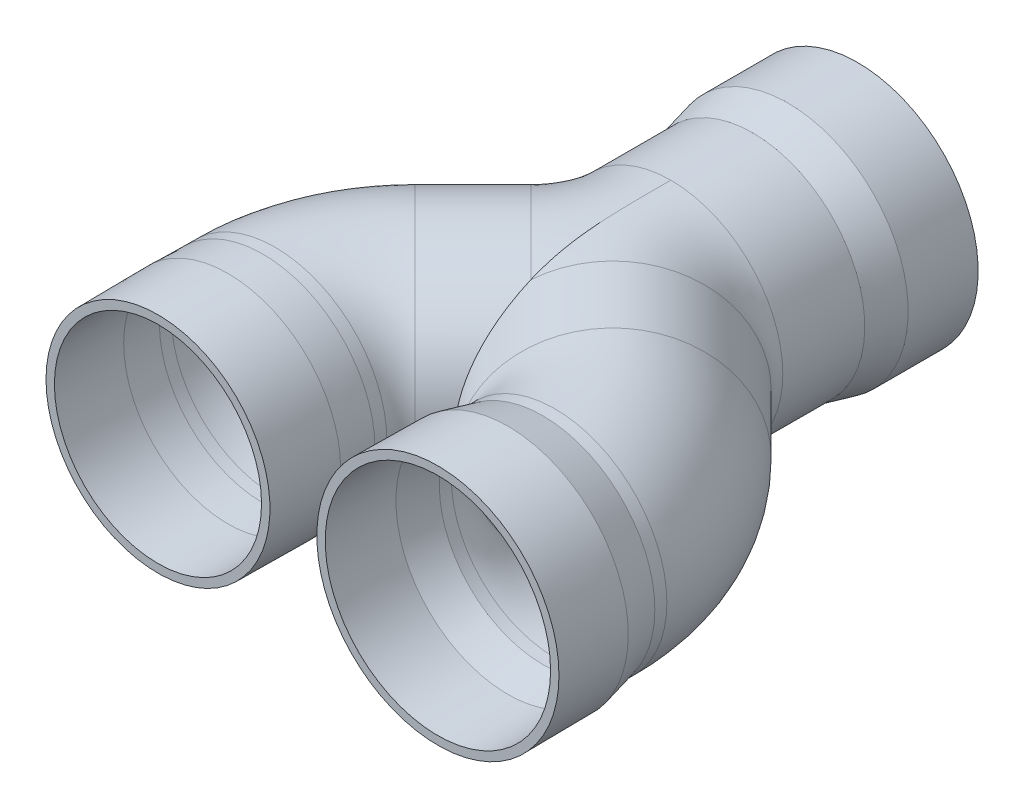
ISO-10303-21;
HEADER;
FILE_DESCRIPTION(('STEP AP214'),'2;1');
FILE_NAME('part.step','',(''),(''),'','','');
FILE_SCHEMA(('AUTOMOTIVE_DESIGN { 1 0 10303 214 1 1 1 1 }'));
ENDSEC;
DATA;
#1=APPLICATION_CONTEXT('core data for automotive mechanical design processes');
#2=APPLICATION_PROTOCOL_DEFINITION('international standard','automotive_design',2000,#1);
#3=PRODUCT_CONTEXT('',#1,'mechanical');
#4=PRODUCT('Part','Part','',(#3));
#5=PRODUCT_RELATED_PRODUCT_CATEGORY('part','',(#4));
#6=PRODUCT_DEFINITION_FORMATION('','',#4);
#7=PRODUCT_DEFINITION_CONTEXT('part definition',#1,'design');
#8=PRODUCT_DEFINITION('design','',#6,#7);
#9=PRODUCT_DEFINITION_SHAPE('','',#8);
#10=(LENGTH_UNIT() NAMED_UNIT(*) SI_UNIT(.MILLI.,.METRE.));
#11=(NAMED_UNIT(*) PLANE_ANGLE_UNIT() SI_UNIT($,.RADIAN.));
#12=(NAMED_UNIT(*) SI_UNIT($,.STERADIAN.) SOLID_ANGLE_UNIT());
#13=UNCERTAINTY_MEASURE_WITH_UNIT(LENGTH_MEASURE(1.E-05),#10,'distance_accuracy_value','');
#14=(GEOMETRIC_REPRESENTATION_CONTEXT(3) GLOBAL_UNCERTAINTY_ASSIGNED_CONTEXT((#13)) GLOBAL_UNIT_ASSIGNED_CONTEXT((#10,
#11,#12)) REPRESENTATION_CONTEXT('',''));
#15=CARTESIAN_POINT('',(0.,0.,0.));
#16=DIRECTION('',(0.,0.,1.));
#17=DIRECTION('',(1.,0.,0.));
#18=AXIS2_PLACEMENT_3D('',#15,#16,#17);
#19=CARTESIAN_POINT('',(20.,0.,40.0000000000023));
#20=DIRECTION('',(0.,0.,1.));
#21=DIRECTION('',(-1.,0.,0.));
#22=AXIS2_PLACEMENT_3D('',#19,#20,#21);
#23=PLANE('',#22);
#24=CARTESIAN_POINT('',(20.,0.,40.0000000000023));
#25=DIRECTION('',(0.,0.,1.));
#26=DIRECTION('',(1.,0.,0.));
#27=AXIS2_PLACEMENT_3D('',#24,#25,#26);
#28=CIRCLE('',#27,14.8);
#29=CARTESIAN_POINT('',(34.8,0.,40.0000000000023));
#30=VERTEX_POINT('',#29);
#31=EDGE_CURVE('E102',#30,#30,#28,.T.);
#32=ORIENTED_EDGE('',*,*,#31,.F.);
#33=EDGE_LOOP('',(#32));
#34=FACE_BOUND('',#33,.T.);
#35=CARTESIAN_POINT('',(20.,0.,40.0000000000023));
#36=DIRECTION('',(0.,0.,1.));
#37=DIRECTION('',(1.,0.,0.));
#38=AXIS2_PLACEMENT_3D('',#35,#36,#37);
#39=CIRCLE('',#38,14.8001200030001);
#40=CARTESIAN_POINT('',(34.8001200030001,0.,40.0000000000023));
#41=VERTEX_POINT('',#40);
#42=EDGE_CURVE('E88',#41,#41,#39,.T.);
#43=ORIENTED_EDGE('',*,*,#42,.T.);
#44=EDGE_LOOP('',(#43));
#45=FACE_BOUND('',#44,.T.);
#46=ADVANCED_FACE('F34',(#34,#45),#23,.T.);
#47=CARTESIAN_POINT('',(0.,0.,-10.));
#48=DIRECTION('',(0.,0.,1.));
#49=DIRECTION('',(1.,0.,0.));
#50=AXIS2_PLACEMENT_3D('',#47,#48,#49);
#51=CYLINDRICAL_SURFACE('',#50,16.);
#52=CARTESIAN_POINT('',(0.,0.,1.71572875253808));
#53=DIRECTION('',(0.,0.,1.));
#54=DIRECTION('',(1.,0.,0.));
#55=AXIS2_PLACEMENT_3D('',#52,#53,#54);
#56=CIRCLE('',#55,16.);
#57=CARTESIAN_POINT('',(0.,16.,1.71572875253808));
#58=VERTEX_POINT('',#57);
#59=CARTESIAN_POINT('',(0.,-16.,1.71572875253808));
#60=VERTEX_POINT('',#59);
#61=EDGE_CURVE('E202',#58,#60,#56,.T.);
#62=ORIENTED_EDGE('',*,*,#61,.F.);
#63=CARTESIAN_POINT('',(0.,0.,1.71572875253808));
#64=DIRECTION('',(0.,0.,-1.));
#65=DIRECTION('',(-1.,0.,0.));
#66=AXIS2_PLACEMENT_3D('',#63,#64,#65);
#67=CIRCLE('',#66,16.);
#68=EDGE_CURVE('E48',#60,#58,#67,.F.);
#69=ORIENTED_EDGE('',*,*,#68,.F.);
#70=EDGE_LOOP('',(#62,#69));
#71=FACE_BOUND('',#70,.T.);
#72=CARTESIAN_POINT('',(0.,0.,-10.));
#73=DIRECTION('',(0.,0.,-1.));
#74=DIRECTION('',(-1.,0.,0.));
#75=AXIS2_PLACEMENT_3D('',#72,#73,#74);
#76=CIRCLE('',#75,16.);
#77=CARTESIAN_POINT('',(-16.,0.,-10.));
#78=VERTEX_POINT('',#77);
#79=EDGE_CURVE('E205',#78,#78,#76,.T.);
#80=ORIENTED_EDGE('',*,*,#79,.F.);
#81=EDGE_LOOP('',(#80));
#82=FACE_BOUND('',#81,.T.);
#83=ADVANCED_FACE('F193',(#71,#82),#51,.T.);
#84=CARTESIAN_POINT('',(-20.,0.,1.71572875253809));
#85=DIRECTION('',(0.,-1.,0.));
#86=DIRECTION('',(0.,0.,-1.));
#87=AXIS2_PLACEMENT_3D('',#84,#85,#86);
#88=TOROIDAL_SURFACE('',#87,20.,16.);
#89=CARTESIAN_POINT('',(0.,-16.,1.71572875253809));
#90=CARTESIAN_POINT('',(0.,-15.9999995885486,1.78239541911259));
#91=CARTESIAN_POINT('',(0.,-15.999999719359,1.84906208579586));
#92=CARTESIAN_POINT('',(0.,-16.0000012587947,2.26057820688588));
#93=CARTESIAN_POINT('',(0.,-16.000005721768,2.60542766281114));
#94=CARTESIAN_POINT('',(0.,-15.9999037118699,3.2951266426043));
#95=CARTESIAN_POINT('',(0.,-15.9997972389732,3.63997616647219));
#96=CARTESIAN_POINT('',(0.,-15.9991737972668,4.3296819948509));
#97=CARTESIAN_POINT('',(0.,-15.9986568201817,4.67453829935826));
#98=CARTESIAN_POINT('',(0.,-15.996752152358,5.36424898287449));
#99=CARTESIAN_POINT('',(0.,-15.9953644610352,5.70910336188191));
#100=CARTESIAN_POINT('',(0.,-15.9911108252302,6.39915390088599));
#101=CARTESIAN_POINT('',(0.,-15.9882433853057,6.74435005337399));
#102=CARTESIAN_POINT('',(0.,-15.9802912799317,7.43471620589881));
#103=CARTESIAN_POINT('',(0.,-15.9752066117847,7.7798862059033));
#104=CARTESIAN_POINT('',(0.,-15.9553908978026,8.81530822843345));
#105=CARTESIAN_POINT('',(0.,-15.9360981126954,9.50549191150325));
#106=CARTESIAN_POINT('',(0.,-15.8778805648637,10.8818664699217));
#107=CARTESIAN_POINT('',(0.,-15.8390481349272,11.5680609108729));
#108=CARTESIAN_POINT('',(0.,-15.7335817334583,12.9385122892618));
#109=CARTESIAN_POINT('',(0.,-15.6669444375954,13.6227689851722));
#110=CARTESIAN_POINT('',(0.,-15.4977470971346,14.9852980113396));
#111=CARTESIAN_POINT('',(0.,-15.3952734483504,15.66358074764));
#112=CARTESIAN_POINT('',(0.,-15.1464206410807,17.0119371498042));
#113=CARTESIAN_POINT('',(0.,-15.0000635790645,17.6820147708365));
#114=CARTESIAN_POINT('',(0.,-14.7078361883334,18.8096463382895));
#115=CARTESIAN_POINT('',(0.,-14.575021141721,19.2705870631802));
#116=CARTESIAN_POINT('',(0.,-14.2821034083281,20.1839050741359));
#117=CARTESIAN_POINT('',(0.,-14.1219944453823,20.6362803639588));
#118=CARTESIAN_POINT('',(0.,-13.7728260744771,21.529158410911));
#119=CARTESIAN_POINT('',(0.,-13.5838010880145,21.9696745613851));
#120=CARTESIAN_POINT('',(0.,-13.1752011743323,22.8362841545151));
#121=CARTESIAN_POINT('',(0.,-12.9556310529747,23.2623798529468));
#122=CARTESIAN_POINT('',(0.,-12.4838713072097,24.0986126157083));
#123=CARTESIAN_POINT('',(0.,-12.2315454733101,24.5086731759023));
#124=CARTESIAN_POINT('',(0.,-11.6946121478873,25.3069918875532));
#125=CARTESIAN_POINT('',(0.,-11.4100124732465,25.6952552844737));
#126=CARTESIAN_POINT('',(0.,-10.8058736294958,26.4494663755816));
#127=CARTESIAN_POINT('',(0.,-10.4860459257667,26.8151845919195));
#128=CARTESIAN_POINT('',(0.,-9.98230787094179,27.3409883488809));
#129=CARTESIAN_POINT('',(0.,-9.81027271589528,27.5125677465881));
#130=CARTESIAN_POINT('',(0.,-9.45838753273782,27.8475676227136));
#131=CARTESIAN_POINT('',(0.,-9.27853634030152,28.0109868777006));
#132=CARTESIAN_POINT('',(0.,-9.09486800643466,28.1700658381668));
#133=B_SPLINE_CURVE_WITH_KNOTS('',3,(#89,#90,#91,#92,#93,#94,#95,#96,#97,#98,#99,#100,#101,#102,
#103,#104,#105,#106,#107,#108,#109,#110,#111,#112,#113,#114,#115,#116,#117,#118,#119,#120,#121,
#122,#123,#124,#125,#126,#127,#128,#129,#130,#131,#132),.UNSPECIFIED.,.F.,.F.,(4,2,2,2,2,2,2,2,
2,2,2,2,2,2,2,2,2,2,2,2,2,4),(0.,0.200000000000003,1.23454836187082,2.26909695947258,
3.30366641330175,4.33823656139013,5.37385430547361,6.40947330950129,8.48065240893641,
10.5421349848976,12.6038641009338,14.6606565932836,16.7164151699843,18.1547599548017,
19.59343593052,21.0304124518326,22.4671631395818,23.9100921115144,25.3526723424225,
26.8080971516561,27.5367845100533,28.2655807928366),.UNSPECIFIED.);
#134=CARTESIAN_POINT('',(0.,-13.6883472303443,21.7157287525382));
#135=VERTEX_POINT('',#134);
#136=EDGE_CURVE('E161',#135,#60,#133,.F.);
#137=ORIENTED_EDGE('',*,*,#136,.F.);
#138=CARTESIAN_POINT('',(-5.85786437626908,0.,15.8578643762691));
#139=DIRECTION('',(-0.707106781186549,0.,0.707106781186546));
#140=DIRECTION('',(0.707106781186546,0.,0.707106781186549));
#141=AXIS2_PLACEMENT_3D('',#138,#139,#140);
#142=CIRCLE('',#141,16.);
#143=CARTESIAN_POINT('',(0.,13.6883472303443,21.7157287525382));
#144=VERTEX_POINT('',#143);
#145=EDGE_CURVE('E292',#144,#135,#142,.T.);
#146=ORIENTED_EDGE('',*,*,#145,.F.);
#147=CARTESIAN_POINT('',(0.,16.,1.71572875253809));
#148=CARTESIAN_POINT('',(0.,15.999999585109,1.7823954185869));
#149=CARTESIAN_POINT('',(0.,15.9999997164776,1.84906208535536));
#150=CARTESIAN_POINT('',(0.,16.000001273304,2.26047363364034));
#151=CARTESIAN_POINT('',(0.,16.0000058109927,2.60521852582061));
#152=CARTESIAN_POINT('',(0.,15.9999037145828,3.29470832561645));
#153=CARTESIAN_POINT('',(0.,15.9997970804592,3.63945323323201));
#154=CARTESIAN_POINT('',(0.,15.9991750898949,4.32894995058784));
#155=CARTESIAN_POINT('',(0.,15.998659725291,4.67370176032845));
#156=CARTESIAN_POINT('',(0.,15.9967544433048,5.36320276173358));
#157=CARTESIAN_POINT('',(0.,15.9953645253293,5.70795195339617));
#158=CARTESIAN_POINT('',(0.,15.9890060872634,6.74288008923015));
#159=CARTESIAN_POINT('',(0.,15.9818472950911,7.43305183328253));
#160=CARTESIAN_POINT('',(0.,15.9554284181753,8.81318951708522));
#161=CARTESIAN_POINT('',(0.,15.9361685980154,9.50315546100527));
#162=CARTESIAN_POINT('',(0.,15.8780082569895,10.8795117182968));
#163=CARTESIAN_POINT('',(0.,15.8391882781953,11.565905125708));
#164=CARTESIAN_POINT('',(0.,15.7337429083843,12.9367515905961));
#165=CARTESIAN_POINT('',(0.,15.6671142495027,13.6212044105096));
#166=CARTESIAN_POINT('',(0.,15.497912554545,14.9841618024999));
#167=CARTESIAN_POINT('',(0.,15.3954242856575,15.6626765677884));
#168=CARTESIAN_POINT('',(0.,15.1465213003002,17.0114784722503));
#169=CARTESIAN_POINT('',(0.,15.0001283869091,17.6817695237444));
#170=CARTESIAN_POINT('',(0.,14.6884444818829,18.8844701047335));
#171=CARTESIAN_POINT('',(0.,14.5318695745793,19.4191273575059));
#172=CARTESIAN_POINT('',(0.,14.1814409259142,20.476439192315));
#173=CARTESIAN_POINT('',(0.,13.9875727257976,20.9990890307641));
#174=CARTESIAN_POINT('',(0.,13.5602764673973,22.0266441903181));
#175=CARTESIAN_POINT('',(0.,13.3269396746201,22.5315872752327));
#176=CARTESIAN_POINT('',(0.,12.8184087571785,23.5198225258644));
#177=CARTESIAN_POINT('',(0.,12.5432375576937,24.0031263632109));
#178=CARTESIAN_POINT('',(0.,12.094385574252,24.7138741591742));
#179=CARTESIAN_POINT('',(0.,11.93647486034,24.9513825609238));
#180=CARTESIAN_POINT('',(0.,11.6092924174464,25.4184548218814));
#181=CARTESIAN_POINT('',(0.,11.4400212698403,25.6480190867245));
#182=CARTESIAN_POINT('',(0.,11.0896620299194,26.098982514541));
#183=CARTESIAN_POINT('',(0.,10.9085422802307,26.3203571049578));
#184=CARTESIAN_POINT('',(0.,10.5350068761272,26.7534443816095));
#185=CARTESIAN_POINT('',(0.,10.3425886575052,26.9651548550275));
#186=CARTESIAN_POINT('',(0.,10.144610613478,27.1715728752538));
#187=B_SPLINE_CURVE_WITH_KNOTS('',3,(#147,#148,#149,#150,#151,#152,#153,#154,#155,#156,#157,
#158,#159,#160,#161,#162,#163,#164,#165,#166,#167,#168,#169,#170,#171,#172,#173,#174,#175,#176,
#177,#178,#179,#180,#181,#182,#183,#184,#185,#186),.UNSPECIFIED.,.F.,.F.,(4,2,2,2,2,2,2,2,2,2,2,
2,2,2,2,2,2,2,2,4),(0.,0.200000000000003,1.23423463530084,2.26846950380711,3.30272502878649,
4.33698125518974,6.40755696514552,8.47808740446149,10.5401609383907,12.6024768597937,
14.6599503234666,16.7164037314003,18.3865461757567,20.0573374506832,21.7243167922145,
23.3903859030564,24.2457418704929,25.1010540980133,25.9587530967588,26.8166475098539),.UNSPECIFIED.);
#188=EDGE_CURVE('E55',#58,#144,#187,.T.);
#189=ORIENTED_EDGE('',*,*,#188,.F.);
#190=ORIENTED_EDGE('',*,*,#61,.T.);
#191=EDGE_LOOP('',(#137,#146,#189,#190));
#192=FACE_BOUND('',#191,.T.);
#193=ADVANCED_FACE('F167',(#192),#88,.T.);
#194=CARTESIAN_POINT('',(-5.85786437626908,0.,15.8578643762691));
#195=DIRECTION('',(-0.707106781186547,0.,0.707106781186548));
#196=DIRECTION('',(0.707106781186548,0.,0.707106781186547));
#197=AXIS2_PLACEMENT_3D('',#194,#195,#196);
#198=CYLINDRICAL_SURFACE('',#197,16.);
#199=CARTESIAN_POINT('',(0.,0.,9.99999999999998));
#200=DIRECTION('',(-1.,0.,0.));
#201=DIRECTION('',(0.,0.,1.));
#202=AXIS2_PLACEMENT_3D('',#199,#200,#201);
#203=ELLIPSE('',#202,22.6274169979695,16.);
#204=EDGE_CURVE('E11',#144,#135,#203,.F.);
#205=ORIENTED_EDGE('',*,*,#204,.F.);
#206=ORIENTED_EDGE('',*,*,#145,.T.);
#207=EDGE_LOOP('',(#205,#206));
#208=FACE_BOUND('',#207,.T.);
#209=CARTESIAN_POINT('',(-14.1421356237309,0.,24.1421356237309));
#210=DIRECTION('',(-0.707106781186547,0.,0.707106781186548));
#211=DIRECTION('',(0.707106781186548,0.,0.707106781186547));
#212=AXIS2_PLACEMENT_3D('',#209,#210,#211);
#213=CIRCLE('',#212,16.);
#214=CARTESIAN_POINT('',(-25.4558441227157,0.,12.8284271247461));
#215=VERTEX_POINT('',#214);
#216=EDGE_CURVE('E293',#215,#215,#213,.T.);
#217=ORIENTED_EDGE('',*,*,#216,.F.);
#218=EDGE_LOOP('',(#217));
#219=FACE_BOUND('',#218,.T.);
#220=ADVANCED_FACE('F200',(#208,#219),#198,.T.);
#221=CARTESIAN_POINT('',(0.,0.,38.2842712474619));
#222=DIRECTION('',(0.,1.,0.));
#223=DIRECTION('',(0.,0.,1.));
#224=AXIS2_PLACEMENT_3D('',#221,#222,#223);
#225=TOROIDAL_SURFACE('',#224,20.,16.);
#226=CARTESIAN_POINT('',(-20.,0.,38.2842712474618));
#227=DIRECTION('',(0.,0.,1.));
#228=DIRECTION('',(1.,0.,0.));
#229=AXIS2_PLACEMENT_3D('',#226,#227,#228);
#230=CIRCLE('',#229,16.);
#231=CARTESIAN_POINT('',(-36.,0.,38.2842712474618));
#232=VERTEX_POINT('',#231);
#233=EDGE_CURVE('E298',#232,#232,#230,.T.);
#234=CARTESIAN_POINT('',(0.,0.,38.2842712474619));
#235=DIRECTION('',(0.,1.,0.));
#236=DIRECTION('',(0.,0.,1.));
#237=AXIS2_PLACEMENT_3D('',#234,#235,#236);
#238=CIRCLE('',#237,36.);
#239=EDGE_CURVE('',#215,#232,#238,.T.);
#240=ORIENTED_EDGE('',*,*,#216,.T.);
#241=ORIENTED_EDGE('',*,*,#233,.F.);
#242=ORIENTED_EDGE('',*,*,#239,.T.);
#243=ORIENTED_EDGE('',*,*,#239,.F.);
#244=EDGE_LOOP('',(#240,#242,#241,#243));
#245=FACE_BOUND('',#244,.T.);
#246=ADVANCED_FACE('F307',(#245),#225,.T.);
#247=CARTESIAN_POINT('',(-20.,0.,38.2842712474619));
#248=DIRECTION('',(0.,0.,1.));
#249=DIRECTION('',(1.,0.,0.));
#250=AXIS2_PLACEMENT_3D('',#247,#248,#249);
#251=CYLINDRICAL_SURFACE('',#250,16.);
#252=CARTESIAN_POINT('',(-20.,0.,40.0000000000023));
#253=DIRECTION('',(0.,0.,1.));
#254=DIRECTION('',(1.,0.,0.));
#255=AXIS2_PLACEMENT_3D('',#252,#253,#254);
#256=CIRCLE('',#255,16.);
#257=CARTESIAN_POINT('',(-3.99999999999999,0.,40.0000000000023));
#258=VERTEX_POINT('',#257);
#259=EDGE_CURVE('E38',#258,#258,#256,.T.);
#260=ORIENTED_EDGE('',*,*,#259,.F.);
#261=EDGE_LOOP('',(#260));
#262=FACE_BOUND('',#261,.T.);
#263=ORIENTED_EDGE('',*,*,#233,.T.);
#264=EDGE_LOOP('',(#263));
#265=FACE_BOUND('',#264,.T.);
#266=ADVANCED_FACE('F36',(#262,#265),#251,.T.);
#267=CARTESIAN_POINT('',(20.,0.,1.71572875253809));
#268=DIRECTION('',(0.,1.,0.));
#269=DIRECTION('',(0.,0.,1.));
#270=AXIS2_PLACEMENT_3D('',#267,#268,#269);
#271=TOROIDAL_SURFACE('',#270,20.,16.);
#272=CARTESIAN_POINT('',(5.85786437626908,0.,15.8578643762691));
#273=DIRECTION('',(-0.707106781186549,0.,-0.707106781186546));
#274=DIRECTION('',(-0.707106781186546,0.,0.707106781186549));
#275=AXIS2_PLACEMENT_3D('',#272,#273,#274);
#276=CIRCLE('',#275,16.);
#277=EDGE_CURVE('E142',#135,#144,#276,.F.);
#278=ORIENTED_EDGE('',*,*,#277,.F.);
#279=ORIENTED_EDGE('',*,*,#136,.T.);
#280=ORIENTED_EDGE('',*,*,#68,.T.);
#281=ORIENTED_EDGE('',*,*,#188,.T.);
#282=EDGE_LOOP('',(#278,#279,#280,#281));
#283=FACE_BOUND('',#282,.T.);
#284=ADVANCED_FACE('F171',(#283),#271,.T.);
#285=CARTESIAN_POINT('',(5.85786437626908,0.,15.8578643762691));
#286=DIRECTION('',(0.707106781186547,0.,0.707106781186548));
#287=DIRECTION('',(0.707106781186548,0.,-0.707106781186547));
#288=AXIS2_PLACEMENT_3D('',#285,#286,#287);
#289=CYLINDRICAL_SURFACE('',#288,16.);
#290=CARTESIAN_POINT('',(14.1421356237309,0.,24.1421356237309));
#291=DIRECTION('',(-0.707106781186547,0.,-0.707106781186548));
#292=DIRECTION('',(-0.707106781186548,0.,0.707106781186547));
#293=AXIS2_PLACEMENT_3D('',#290,#291,#292);
#294=CIRCLE('',#293,16.);
#295=CARTESIAN_POINT('',(25.4558441227157,0.,12.8284271247461));
#296=VERTEX_POINT('',#295);
#297=EDGE_CURVE('E145',#296,#296,#294,.F.);
#298=ORIENTED_EDGE('',*,*,#297,.F.);
#299=EDGE_LOOP('',(#298));
#300=FACE_BOUND('',#299,.T.);
#301=ORIENTED_EDGE('',*,*,#277,.T.);
#302=ORIENTED_EDGE('',*,*,#204,.T.);
#303=EDGE_LOOP('',(#301,#302));
#304=FACE_BOUND('',#303,.T.);
#305=ADVANCED_FACE('F176',(#300,#304),#289,.T.);
#306=CARTESIAN_POINT('',(0.,0.,38.2842712474619));
#307=DIRECTION('',(0.,-1.,0.));
#308=DIRECTION('',(0.,0.,-1.));
#309=AXIS2_PLACEMENT_3D('',#306,#307,#308);
#310=TOROIDAL_SURFACE('',#309,20.,16.);
#311=CARTESIAN_POINT('',(20.,0.,38.2842712474618));
#312=DIRECTION('',(0.,0.,-1.));
#313=DIRECTION('',(-1.,0.,0.));
#314=AXIS2_PLACEMENT_3D('',#311,#312,#313);
#315=CIRCLE('',#314,16.);
#316=CARTESIAN_POINT('',(36.,0.,38.2842712474618));
#317=VERTEX_POINT('',#316);
#318=EDGE_CURVE('E148',#317,#317,#315,.F.);
#319=CARTESIAN_POINT('',(0.,0.,38.2842712474619));
#320=DIRECTION('',(0.,-1.,0.));
#321=DIRECTION('',(0.,0.,-1.));
#322=AXIS2_PLACEMENT_3D('',#319,#320,#321);
#323=CIRCLE('',#322,36.);
#324=EDGE_CURVE('',#296,#317,#323,.T.);
#325=ORIENTED_EDGE('',*,*,#297,.T.);
#326=ORIENTED_EDGE('',*,*,#318,.F.);
#327=ORIENTED_EDGE('',*,*,#324,.T.);
#328=ORIENTED_EDGE('',*,*,#324,.F.);
#329=EDGE_LOOP('',(#325,#327,#326,#328));
#330=FACE_BOUND('',#329,.T.);
#331=ADVANCED_FACE('F184',(#330),#310,.T.);
#332=CARTESIAN_POINT('',(20.,0.,38.2842712474619));
#333=DIRECTION('',(0.,0.,1.));
#334=DIRECTION('',(1.,0.,0.));
#335=AXIS2_PLACEMENT_3D('',#332,#333,#334);
#336=CYLINDRICAL_SURFACE('',#335,16.);
#337=CARTESIAN_POINT('',(20.,0.,40.0000000000023));
#338=DIRECTION('',(0.,0.,-1.));
#339=DIRECTION('',(-1.,0.,0.));
#340=AXIS2_PLACEMENT_3D('',#337,#338,#339);
#341=CIRCLE('',#340,16.);
#342=CARTESIAN_POINT('',(3.99999999999999,0.,40.0000000000023));
#343=VERTEX_POINT('',#342);
#344=EDGE_CURVE('E151',#343,#343,#341,.F.);
#345=ORIENTED_EDGE('',*,*,#344,.F.);
#346=EDGE_LOOP('',(#345));
#347=FACE_BOUND('',#346,.T.);
#348=ORIENTED_EDGE('',*,*,#318,.T.);
#349=EDGE_LOOP('',(#348));
#350=FACE_BOUND('',#349,.T.);
#351=ADVANCED_FACE('F188',(#347,#350),#336,.T.);
#352=CARTESIAN_POINT('',(0.,0.,-10.));
#353=DIRECTION('',(0.,0.,1.));
#354=DIRECTION('',(1.,0.,0.));
#355=AXIS2_PLACEMENT_3D('',#352,#353,#354);
#356=CYLINDRICAL_SURFACE('',#355,14.8);
#357=CARTESIAN_POINT('',(0.,0.,1.71572875253806));
#358=DIRECTION('',(0.,0.,-1.));
#359=DIRECTION('',(-1.,0.,0.));
#360=AXIS2_PLACEMENT_3D('',#357,#358,#359);
#361=CIRCLE('',#360,14.8);
#362=CARTESIAN_POINT('',(0.,14.8,1.71572875253808));
#363=VERTEX_POINT('',#362);
#364=CARTESIAN_POINT('',(0.,-14.8,1.71572875253809));
#365=VERTEX_POINT('',#364);
#366=EDGE_CURVE('E90',#363,#365,#361,.F.);
#367=ORIENTED_EDGE('',*,*,#366,.T.);
#368=CARTESIAN_POINT('',(0.,0.,1.71572875253805));
#369=DIRECTION('',(0.,0.,-1.));
#370=DIRECTION('',(-1.,0.,0.));
#371=AXIS2_PLACEMENT_3D('',#368,#369,#370);
#372=CIRCLE('',#371,14.8);
#373=EDGE_CURVE('E76',#365,#363,#372,.F.);
#374=ORIENTED_EDGE('',*,*,#373,.T.);
#375=EDGE_LOOP('',(#367,#374));
#376=FACE_BOUND('',#375,.T.);
#377=CARTESIAN_POINT('',(0.,0.,-10.));
#378=DIRECTION('',(0.,0.,1.));
#379=DIRECTION('',(1.,0.,0.));
#380=AXIS2_PLACEMENT_3D('',#377,#378,#379);
#381=CIRCLE('',#380,14.8);
#382=CARTESIAN_POINT('',(14.8,0.,-10.));
#383=VERTEX_POINT('',#382);
#384=EDGE_CURVE('E95',#383,#383,#381,.T.);
#385=ORIENTED_EDGE('',*,*,#384,.F.);
#386=EDGE_LOOP('',(#385));
#387=FACE_BOUND('',#386,.T.);
#388=ADVANCED_FACE('F91',(#376,#387),#356,.F.);
#389=CARTESIAN_POINT('',(-20.,0.,1.71572875253809));
#390=DIRECTION('',(0.,-1.,0.));
#391=DIRECTION('',(0.,0.,-1.));
#392=AXIS2_PLACEMENT_3D('',#389,#390,#391);
#393=TOROIDAL_SURFACE('',#392,20.,14.8);
#394=CARTESIAN_POINT('',(0.,-14.8,1.71572875253809));
#395=CARTESIAN_POINT('',(0.,-14.7999994086356,1.7823954189578));
#396=CARTESIAN_POINT('',(0.,-14.7999995716316,1.8490620856624));
#397=CARTESIAN_POINT('',(0.,-14.8000023862829,2.32460674234517));
#398=CARTESIAN_POINT('',(0.,-14.8000135177999,2.73348473858812));
#399=CARTESIAN_POINT('',(0.,-14.7998119935245,3.55124104762921));
#400=CARTESIAN_POINT('',(0.,-14.7995993375373,3.96011936042733));
#401=CARTESIAN_POINT('',(0.,-14.7983258919829,4.7779010906094));
#402=CARTESIAN_POINT('',(0.,-14.7972650491306,5.18680450795665));
#403=CARTESIAN_POINT('',(0.,-14.7933389364576,6.00460385110781));
#404=CARTESIAN_POINT('',(0.,-14.7904736652243,6.41349977690559));
#405=CARTESIAN_POINT('',(0.,-14.781684408261,7.23218400858331));
#406=CARTESIAN_POINT('',(0.,-14.7757535630598,7.64197225480966));
#407=CARTESIAN_POINT('',(0.,-14.7593329050132,8.46145452684864));
#408=CARTESIAN_POINT('',(0.,-14.7488430729755,8.87114855225735));
#409=CARTESIAN_POINT('',(0.,-14.7080574809388,10.099904700957));
#410=CARTESIAN_POINT('',(0.,-14.6684453727757,10.9187291625404));
#411=CARTESIAN_POINT('',(0.,-14.5553610723728,12.4746885990807));
#412=CARTESIAN_POINT('',(0.,-14.4855308279633,13.2120712492241));
#413=CARTESIAN_POINT('',(0.,-14.3020893335383,14.6817134116457));
#414=CARTESIAN_POINT('',(0.,-14.1884727751138,15.4139722917831));
#415=CARTESIAN_POINT('',(0.,-13.9073343535197,16.8628679025969));
#416=CARTESIAN_POINT('',(0.,-13.740205551668,17.5795790656803));
#417=CARTESIAN_POINT('',(0.,-13.3417886455689,18.9950243261899));
#418=CARTESIAN_POINT('',(0.,-13.1105361022761,19.6937681537023));
#419=CARTESIAN_POINT('',(0.,-12.6768844680397,20.8037397221887));
#420=CARTESIAN_POINT('',(0.,-12.4966927878751,21.2236908640897));
#421=CARTESIAN_POINT('',(0.,-12.1068552674181,22.0495458932131));
#422=CARTESIAN_POINT('',(0.,-11.8972226838687,22.4554560009124));
#423=CARTESIAN_POINT('',(0.,-11.4441322992907,23.2555890729015));
#424=CARTESIAN_POINT('',(0.,-11.200243215565,23.6495698327648));
#425=CARTESIAN_POINT('',(0.,-10.810228490865,24.2244184365866));
#426=CARTESIAN_POINT('',(0.,-10.6760804437515,24.4134873049074));
#427=CARTESIAN_POINT('',(0.,-10.3997175028167,24.7856794076202));
#428=CARTESIAN_POINT('',(0.,-10.2575012988758,24.9688016687581));
#429=CARTESIAN_POINT('',(0.,-10.1112484749093,25.1486918807714));
#430=B_SPLINE_CURVE_WITH_KNOTS('',3,(#394,#395,#396,#397,#398,#399,#400,#401,#402,#403,#404,
#405,#406,#407,#408,#409,#410,#411,#412,#413,#414,#415,#416,#417,#418,#419,#420,#421,#422,#423,
#424,#425,#426,#427,#428,#429),.UNSPECIFIED.,.F.,.F.,(4,2,2,2,2,2,2,2,2,2,2,2,2,2,2,2,2,4),(0.,
0.200000000000003,1.42663396557526,2.65326899972378,3.87998109989404,5.10669416041453,
6.33616405058539,7.56563911663018,10.0243245201973,12.2454167587158,14.4667783548435,
16.6721840141368,18.8763690643873,20.246289931188,21.6155959117516,23.0040142804307,
23.6992981058934,24.3946951575773),.UNSPECIFIED.);
#431=CARTESIAN_POINT('',(0.,-12.2642101212625,21.715728752538));
#432=VERTEX_POINT('',#431);
#433=EDGE_CURVE('E81',#432,#365,#430,.F.);
#434=ORIENTED_EDGE('',*,*,#433,.T.);
#435=ORIENTED_EDGE('',*,*,#366,.F.);
#436=CARTESIAN_POINT('',(0.,14.8,1.71572875253809));
#437=CARTESIAN_POINT('',(0.,14.7999994083467,1.78239541895732));
#438=CARTESIAN_POINT('',(0.,14.7999995713824,1.84906208566198));
#439=CARTESIAN_POINT('',(0.,14.8000023885096,2.32472462470946));
#440=CARTESIAN_POINT('',(0.,14.800013535163,2.73372050333367));
#441=CARTESIAN_POINT('',(0.,14.7998118033004,3.55171257807235));
#442=CARTESIAN_POINT('',(0.,14.7995989245887,3.96070877418679));
#443=CARTESIAN_POINT('',(0.,14.7983241011561,4.77872634093087));
#444=CARTESIAN_POINT('',(0.,14.7972621029596,5.18774771152366));
#445=CARTESIAN_POINT('',(0.,14.7933316919716,6.00578294490642));
#446=CARTESIAN_POINT('',(0.,14.7904632777708,6.41479680769029));
#447=CARTESIAN_POINT('',(0.,14.7816643983149,7.2337164626447));
#448=CARTESIAN_POINT('',(0.,14.7757270710741,7.64362219509416));
#449=CARTESIAN_POINT('',(0.,14.7592885548174,8.46333926316681));
#450=CARTESIAN_POINT('',(0.,14.7487873464967,8.87315059838336));
#451=CARTESIAN_POINT('',(0.,14.7079577682638,10.1022578572431));
#452=CARTESIAN_POINT('',(0.,14.6683031914238,10.9213157071076));
#453=CARTESIAN_POINT('',(0.,14.5551296859853,12.4773022202982));
#454=CARTESIAN_POINT('',(0.,14.4852744628157,13.2144802569877));
#455=CARTESIAN_POINT('',(0.,14.3017954398704,14.6837118176317));
#456=CARTESIAN_POINT('',(0.,14.1881663370295,15.4157647097465));
#457=CARTESIAN_POINT('',(0.,13.9070244335185,16.8642530693195));
#458=CARTESIAN_POINT('',(0.,13.7399043618937,17.5807629295379));
#459=CARTESIAN_POINT('',(0.,13.3415351120533,18.9958112328582));
#460=CARTESIAN_POINT('',(0.,13.1103214373723,19.6943593921088));
#461=CARTESIAN_POINT('',(0.,12.6767123974875,20.8041541336445));
#462=CARTESIAN_POINT('',(0.,12.4965044554185,21.2241167320532));
#463=CARTESIAN_POINT('',(0.,12.1066317561038,22.0499924916626));
#464=CARTESIAN_POINT('',(0.,11.8969802570847,22.4559118744506));
#465=CARTESIAN_POINT('',(0.,11.4438495554186,23.2560602138533));
#466=CARTESIAN_POINT('',(0.,11.1999390903485,23.6500469606209));
#467=CARTESIAN_POINT('',(0.,10.8098904906099,24.2249021245367));
#468=CARTESIAN_POINT('',(0.,10.6757308300094,24.4139727910213));
#469=CARTESIAN_POINT('',(0.,10.3993440980906,24.786167606708));
#470=CARTESIAN_POINT('',(0.,10.2571157164233,24.9692907824089));
#471=CARTESIAN_POINT('',(0.,10.1108504511332,25.1491814331208));
#472=B_SPLINE_CURVE_WITH_KNOTS('',3,(#436,#437,#438,#439,#440,#441,#442,#443,#444,#445,#446,
#447,#448,#449,#450,#451,#452,#453,#454,#455,#456,#457,#458,#459,#460,#461,#462,#463,#464,#465,
#466,#467,#468,#469,#470,#471),.UNSPECIFIED.,.F.,.F.,(4,2,2,2,2,2,2,2,2,2,2,2,2,2,2,2,2,4),(0.,
0.200000000000001,1.42698761265942,2.65397629698475,3.88104226012436,5.10810918051487,
6.33793172649273,7.56775947456761,10.0271490210202,12.2476373369015,14.4683947424616,
16.6732076602136,18.8768016924402,20.2467731638188,21.6161297128938,23.0045968453478,
23.6999052013809,24.3953267995779),.UNSPECIFIED.);
#473=CARTESIAN_POINT('',(0.,12.2642101212624,21.7157287525381));
#474=VERTEX_POINT('',#473);
#475=EDGE_CURVE('E84',#363,#474,#472,.T.);
#476=ORIENTED_EDGE('',*,*,#475,.T.);
#477=CARTESIAN_POINT('',(-5.85786437626909,0.,15.8578643762691));
#478=DIRECTION('',(-0.707106781186547,0.,0.707106781186548));
#479=DIRECTION('',(0.707106781186548,0.,0.707106781186547));
#480=AXIS2_PLACEMENT_3D('',#477,#478,#479);
#481=CIRCLE('',#480,14.8);
#482=EDGE_CURVE('E94',#474,#432,#481,.T.);
#483=ORIENTED_EDGE('',*,*,#482,.T.);
#484=EDGE_LOOP('',(#434,#435,#476,#483));
#485=FACE_BOUND('',#484,.T.);
#486=ADVANCED_FACE('F97',(#485),#393,.F.);
#487=CARTESIAN_POINT('',(-5.85786437626908,0.,15.8578643762691));
#488=DIRECTION('',(-0.707106781186547,0.,0.707106781186548));
#489=DIRECTION('',(0.707106781186548,0.,0.707106781186547));
#490=AXIS2_PLACEMENT_3D('',#487,#488,#489);
#491=CYLINDRICAL_SURFACE('',#490,14.8);
#492=CARTESIAN_POINT('',(0.,0.,9.99999999999998));
#493=DIRECTION('',(-1.,0.,0.));
#494=DIRECTION('',(0.,0.,1.));
#495=AXIS2_PLACEMENT_3D('',#492,#493,#494);
#496=ELLIPSE('',#495,20.9303607231218,14.8);
#497=EDGE_CURVE('E124',#474,#432,#496,.F.);
#498=ORIENTED_EDGE('',*,*,#497,.T.);
#499=ORIENTED_EDGE('',*,*,#482,.F.);
#500=EDGE_LOOP('',(#498,#499));
#501=FACE_BOUND('',#500,.T.);
#502=CARTESIAN_POINT('',(-14.1421356237309,0.,24.1421356237309));
#503=DIRECTION('',(0.707106781186548,0.,-0.707106781186547));
#504=DIRECTION('',(-0.707106781186547,0.,-0.707106781186548));
#505=AXIS2_PLACEMENT_3D('',#502,#503,#504);
#506=CIRCLE('',#505,14.8);
#507=CARTESIAN_POINT('',(-24.6073159852918,0.,13.67695526217));
#508=VERTEX_POINT('',#507);
#509=EDGE_CURVE('E127',#508,#508,#506,.F.);
#510=ORIENTED_EDGE('',*,*,#509,.T.);
#511=EDGE_LOOP('',(#510));
#512=FACE_BOUND('',#511,.T.);
#513=ADVANCED_FACE('F116',(#501,#512),#491,.F.);
#514=CARTESIAN_POINT('',(0.,0.,38.2842712474619));
#515=DIRECTION('',(0.,1.,0.));
#516=DIRECTION('',(0.,0.,1.));
#517=AXIS2_PLACEMENT_3D('',#514,#515,#516);
#518=TOROIDAL_SURFACE('',#517,20.,14.8);
#519=CARTESIAN_POINT('',(-20.,0.,38.2842712474618));
#520=DIRECTION('',(0.,0.,1.));
#521=DIRECTION('',(1.,0.,0.));
#522=AXIS2_PLACEMENT_3D('',#519,#520,#521);
#523=CIRCLE('',#522,14.8);
#524=CARTESIAN_POINT('',(-34.8,0.,38.2842712474618));
#525=VERTEX_POINT('',#524);
#526=EDGE_CURVE('E126',#525,#525,#523,.T.);
#527=CARTESIAN_POINT('',(0.,0.,38.2842712474619));
#528=DIRECTION('',(0.,1.,0.));
#529=DIRECTION('',(0.,0.,1.));
#530=AXIS2_PLACEMENT_3D('',#527,#528,#529);
#531=CIRCLE('',#530,34.8);
#532=EDGE_CURVE('',#508,#525,#531,.T.);
#533=ORIENTED_EDGE('',*,*,#509,.F.);
#534=ORIENTED_EDGE('',*,*,#526,.T.);
#535=ORIENTED_EDGE('',*,*,#532,.T.);
#536=ORIENTED_EDGE('',*,*,#532,.F.);
#537=EDGE_LOOP('',(#533,#535,#534,#536));
#538=FACE_BOUND('',#537,.T.);
#539=ADVANCED_FACE('F384',(#538),#518,.F.);
#540=CARTESIAN_POINT('',(-20.,0.,38.2842712474619));
#541=DIRECTION('',(0.,0.,1.));
#542=DIRECTION('',(1.,0.,0.));
#543=AXIS2_PLACEMENT_3D('',#540,#541,#542);
#544=CYLINDRICAL_SURFACE('',#543,14.8);
#545=CARTESIAN_POINT('',(-20.,0.,40.0000000000023));
#546=DIRECTION('',(0.,0.,-1.));
#547=DIRECTION('',(-1.,0.,0.));
#548=AXIS2_PLACEMENT_3D('',#545,#546,#547);
#549=CIRCLE('',#548,14.8);
#550=CARTESIAN_POINT('',(-34.8,0.,40.0000000000023));
#551=VERTEX_POINT('',#550);
#552=EDGE_CURVE('E224',#551,#551,#549,.T.);
#553=ORIENTED_EDGE('',*,*,#552,.F.);
#554=EDGE_LOOP('',(#553));
#555=FACE_BOUND('',#554,.T.);
#556=ORIENTED_EDGE('',*,*,#526,.F.);
#557=EDGE_LOOP('',(#556));
#558=FACE_BOUND('',#557,.T.);
#559=ADVANCED_FACE('F178',(#555,#558),#544,.F.);
#560=CARTESIAN_POINT('',(20.,0.,1.71572875253809));
#561=DIRECTION('',(0.,1.,0.));
#562=DIRECTION('',(0.,0.,1.));
#563=AXIS2_PLACEMENT_3D('',#560,#561,#562);
#564=TOROIDAL_SURFACE('',#563,20.,14.8);
#565=CARTESIAN_POINT('',(5.85786437626909,0.,15.8578643762691));
#566=DIRECTION('',(0.707106781186547,0.,0.707106781186548));
#567=DIRECTION('',(0.707106781186548,0.,-0.707106781186547));
#568=AXIS2_PLACEMENT_3D('',#565,#566,#567);
#569=CIRCLE('',#568,14.8);
#570=EDGE_CURVE('E87',#432,#474,#569,.T.);
#571=ORIENTED_EDGE('',*,*,#570,.T.);
#572=ORIENTED_EDGE('',*,*,#475,.F.);
#573=ORIENTED_EDGE('',*,*,#373,.F.);
#574=ORIENTED_EDGE('',*,*,#433,.F.);
#575=EDGE_LOOP('',(#571,#572,#573,#574));
#576=FACE_BOUND('',#575,.T.);
#577=ADVANCED_FACE('F79',(#576),#564,.F.);
#578=CARTESIAN_POINT('',(5.85786437626908,0.,15.8578643762691));
#579=DIRECTION('',(0.707106781186547,0.,0.707106781186548));
#580=DIRECTION('',(0.707106781186548,0.,-0.707106781186547));
#581=AXIS2_PLACEMENT_3D('',#578,#579,#580);
#582=CYLINDRICAL_SURFACE('',#581,14.8);
#583=CARTESIAN_POINT('',(14.1421356237309,0.,24.1421356237309));
#584=DIRECTION('',(-0.707106781186548,0.,-0.707106781186548));
#585=DIRECTION('',(-0.707106781186548,0.,0.707106781186548));
#586=AXIS2_PLACEMENT_3D('',#583,#584,#585);
#587=CIRCLE('',#586,14.8);
#588=CARTESIAN_POINT('',(24.6073159852918,0.,13.67695526217));
#589=VERTEX_POINT('',#588);
#590=EDGE_CURVE('E133',#589,#589,#587,.F.);
#591=ORIENTED_EDGE('',*,*,#590,.T.);
#592=EDGE_LOOP('',(#591));
#593=FACE_BOUND('',#592,.T.);
#594=ORIENTED_EDGE('',*,*,#570,.F.);
#595=ORIENTED_EDGE('',*,*,#497,.F.);
#596=EDGE_LOOP('',(#594,#595));
#597=FACE_BOUND('',#596,.T.);
#598=ADVANCED_FACE('F408',(#593,#597),#582,.F.);
#599=CARTESIAN_POINT('',(0.,0.,38.2842712474619));
#600=DIRECTION('',(0.,-1.,0.));
#601=DIRECTION('',(0.,0.,-1.));
#602=AXIS2_PLACEMENT_3D('',#599,#600,#601);
#603=TOROIDAL_SURFACE('',#602,20.,14.8);
#604=CARTESIAN_POINT('',(20.,0.,38.2842712474618));
#605=DIRECTION('',(0.,0.,1.));
#606=DIRECTION('',(1.,0.,0.));
#607=AXIS2_PLACEMENT_3D('',#604,#605,#606);
#608=CIRCLE('',#607,14.8);
#609=CARTESIAN_POINT('',(34.8,0.,38.2842712474618));
#610=VERTEX_POINT('',#609);
#611=EDGE_CURVE('E136',#610,#610,#608,.T.);
#612=CARTESIAN_POINT('',(0.,0.,38.2842712474619));
#613=DIRECTION('',(0.,-1.,0.));
#614=DIRECTION('',(0.,0.,-1.));
#615=AXIS2_PLACEMENT_3D('',#612,#613,#614);
#616=CIRCLE('',#615,34.8);
#617=EDGE_CURVE('',#589,#610,#616,.T.);
#618=ORIENTED_EDGE('',*,*,#590,.F.);
#619=ORIENTED_EDGE('',*,*,#611,.T.);
#620=ORIENTED_EDGE('',*,*,#617,.T.);
#621=ORIENTED_EDGE('',*,*,#617,.F.);
#622=EDGE_LOOP('',(#618,#620,#619,#621));
#623=FACE_BOUND('',#622,.T.);
#624=ADVANCED_FACE('F415',(#623),#603,.F.);
#625=CARTESIAN_POINT('',(20.,0.,38.2842712474619));
#626=DIRECTION('',(0.,0.,1.));
#627=DIRECTION('',(1.,0.,0.));
#628=AXIS2_PLACEMENT_3D('',#625,#626,#627);
#629=CYLINDRICAL_SURFACE('',#628,14.8);
#630=ORIENTED_EDGE('',*,*,#611,.F.);
#631=EDGE_LOOP('',(#630));
#632=FACE_BOUND('',#631,.T.);
#633=ORIENTED_EDGE('',*,*,#31,.T.);
#634=EDGE_LOOP('',(#633));
#635=FACE_BOUND('',#634,.T.);
#636=ADVANCED_FACE('F179',(#632,#635),#629,.F.);
#637=CARTESIAN_POINT('',(20.,0.,40.0000000000023));
#638=DIRECTION('',(0.,0.,1.));
#639=DIRECTION('',(1.,0.,0.));
#640=AXIS2_PLACEMENT_3D('',#637,#638,#639);
#641=CONICAL_SURFACE('',#640,16.,0.235544980720863);
#642=CARTESIAN_POINT('',(20.,0.,45.0000000000023));
#643=DIRECTION('',(0.,0.,1.));
#644=DIRECTION('',(1.,0.,0.));
#645=AXIS2_PLACEMENT_3D('',#642,#643,#644);
#646=CIRCLE('',#645,17.2);
#647=CARTESIAN_POINT('',(37.2,0.,45.0000000000023));
#648=VERTEX_POINT('',#647);
#649=EDGE_CURVE('E248',#648,#648,#646,.T.);
#650=ORIENTED_EDGE('',*,*,#649,.F.);
#651=EDGE_LOOP('',(#650));
#652=FACE_BOUND('',#651,.T.);
#653=ORIENTED_EDGE('',*,*,#344,.T.);
#654=EDGE_LOOP('',(#653));
#655=FACE_BOUND('',#654,.T.);
#656=ADVANCED_FACE('F277',(#652,#655),#641,.T.);
#657=CARTESIAN_POINT('',(20.,0.,45.0000000000023));
#658=DIRECTION('',(0.,0.,1.));
#659=DIRECTION('',(1.,0.,0.));
#660=AXIS2_PLACEMENT_3D('',#657,#658,#659);
#661=CONICAL_SURFACE('',#660,17.2,0.0100001666741671);
#662=CARTESIAN_POINT('',(20.,0.,54.9994999875017));
#663=DIRECTION('',(0.,0.,1.));
#664=DIRECTION('',(1.,0.,0.));
#665=AXIS2_PLACEMENT_3D('',#662,#663,#664);
#666=CIRCLE('',#665,17.3);
#667=CARTESIAN_POINT('',(37.3,0.,54.9994999875017));
#668=VERTEX_POINT('',#667);
#669=EDGE_CURVE('E245',#668,#668,#666,.T.);
#670=ORIENTED_EDGE('',*,*,#669,.F.);
#671=EDGE_LOOP('',(#670));
#672=FACE_BOUND('',#671,.T.);
#673=ORIENTED_EDGE('',*,*,#649,.T.);
#674=EDGE_LOOP('',(#673));
#675=FACE_BOUND('',#674,.T.);
#676=ADVANCED_FACE('F271',(#672,#675),#661,.T.);
#677=CARTESIAN_POINT('',(20.,17.3,54.9994999875017));
#678=DIRECTION('',(0.,0.,-1.));
#679=DIRECTION('',(-1.,0.,0.));
#680=AXIS2_PLACEMENT_3D('',#677,#678,#679);
#681=PLANE('',#680);
#682=CARTESIAN_POINT('',(20.,0.,54.9994999875017));
#683=DIRECTION('',(0.,0.,1.));
#684=DIRECTION('',(1.,0.,0.));
#685=AXIS2_PLACEMENT_3D('',#682,#683,#684);
#686=CIRCLE('',#685,16.1);
#687=CARTESIAN_POINT('',(36.1,0.,54.9994999875017));
#688=VERTEX_POINT('',#687);
#689=EDGE_CURVE('E242',#688,#688,#686,.T.);
#690=ORIENTED_EDGE('',*,*,#689,.F.);
#691=EDGE_LOOP('',(#690));
#692=FACE_BOUND('',#691,.T.);
#693=ORIENTED_EDGE('',*,*,#669,.T.);
#694=EDGE_LOOP('',(#693));
#695=FACE_BOUND('',#694,.T.);
#696=ADVANCED_FACE('F265',(#692,#695),#681,.F.);
#697=CARTESIAN_POINT('',(20.,0.,54.9994999875017));
#698=DIRECTION('',(0.,0.,1.));
#699=DIRECTION('',(1.,0.,0.));
#700=AXIS2_PLACEMENT_3D('',#697,#698,#699);
#701=CONICAL_SURFACE('',#700,16.1,0.00999966668666518);
#702=CARTESIAN_POINT('',(20.,0.,44.9994999875017));
#703=DIRECTION('',(0.,0.,1.));
#704=DIRECTION('',(1.,0.,0.));
#705=AXIS2_PLACEMENT_3D('',#702,#703,#704);
#706=CIRCLE('',#705,16.);
#707=CARTESIAN_POINT('',(36.,0.,44.9994999875017));
#708=VERTEX_POINT('',#707);
#709=EDGE_CURVE('E239',#708,#708,#706,.T.);
#710=ORIENTED_EDGE('',*,*,#709,.F.);
#711=EDGE_LOOP('',(#710));
#712=FACE_BOUND('',#711,.T.);
#713=ORIENTED_EDGE('',*,*,#689,.T.);
#714=EDGE_LOOP('',(#713));
#715=FACE_BOUND('',#714,.T.);
#716=ADVANCED_FACE('F259',(#712,#715),#701,.F.);
#717=CARTESIAN_POINT('',(20.,0.,44.9994999875017));
#718=DIRECTION('',(0.,0.,1.));
#719=DIRECTION('',(1.,0.,0.));
#720=AXIS2_PLACEMENT_3D('',#717,#718,#719);
#721=CONICAL_SURFACE('',#720,16.,0.235544980720864);
#722=ORIENTED_EDGE('',*,*,#42,.F.);
#723=EDGE_LOOP('',(#722));
#724=FACE_BOUND('',#723,.T.);
#725=ORIENTED_EDGE('',*,*,#709,.T.);
#726=EDGE_LOOP('',(#725));
#727=FACE_BOUND('',#726,.T.);
#728=ADVANCED_FACE('F255',(#724,#727),#721,.F.);
#729=CARTESIAN_POINT('',(-20.,0.,40.0000000000023));
#730=DIRECTION('',(0.,0.,1.));
#731=DIRECTION('',(1.,0.,0.));
#732=AXIS2_PLACEMENT_3D('',#729,#730,#731);
#733=CONICAL_SURFACE('',#732,16.,0.0199973339731497);
#734=CARTESIAN_POINT('',(-20.,0.,45.0000000000023));
#735=DIRECTION('',(0.,0.,-1.));
#736=DIRECTION('',(-1.,0.,0.));
#737=AXIS2_PLACEMENT_3D('',#734,#735,#736);
#738=CIRCLE('',#737,16.1);
#739=CARTESIAN_POINT('',(-36.1,0.,45.0000000000023));
#740=VERTEX_POINT('',#739);
#741=EDGE_CURVE('E236',#740,#740,#738,.T.);
#742=ORIENTED_EDGE('',*,*,#741,.T.);
#743=EDGE_LOOP('',(#742));
#744=FACE_BOUND('',#743,.T.);
#745=ORIENTED_EDGE('',*,*,#259,.T.);
#746=EDGE_LOOP('',(#745));
#747=FACE_BOUND('',#746,.T.);
#748=ADVANCED_FACE('F258',(#744,#747),#733,.T.);
#749=CARTESIAN_POINT('',(-20.,0.,45.0000000000023));
#750=DIRECTION('',(0.,0.,-1.));
#751=DIRECTION('',(-1.,0.,0.));
#752=AXIS2_PLACEMENT_3D('',#749,#750,#751);
#753=CONICAL_SURFACE('',#752,16.1,0.00999966668666484);
#754=CARTESIAN_POINT('',(-20.,0.,55.0000000000023));
#755=DIRECTION('',(0.,0.,-1.));
#756=DIRECTION('',(-1.,0.,0.));
#757=AXIS2_PLACEMENT_3D('',#754,#755,#756);
#758=CIRCLE('',#757,16.);
#759=CARTESIAN_POINT('',(-36.,0.,55.0000000000023));
#760=VERTEX_POINT('',#759);
#761=EDGE_CURVE('E233',#760,#760,#758,.T.);
#762=ORIENTED_EDGE('',*,*,#761,.T.);
#763=EDGE_LOOP('',(#762));
#764=FACE_BOUND('',#763,.T.);
#765=ORIENTED_EDGE('',*,*,#741,.F.);
#766=EDGE_LOOP('',(#765));
#767=FACE_BOUND('',#766,.T.);
#768=ADVANCED_FACE('F464',(#764,#767),#753,.T.);
#769=CARTESIAN_POINT('',(-20.,16.,55.0000000000023));
#770=DIRECTION('',(0.,0.,1.));
#771=DIRECTION('',(1.,0.,0.));
#772=AXIS2_PLACEMENT_3D('',#769,#770,#771);
#773=PLANE('',#772);
#774=CARTESIAN_POINT('',(-20.,0.,55.0000000000023));
#775=DIRECTION('',(0.,0.,-1.));
#776=DIRECTION('',(-1.,0.,0.));
#777=AXIS2_PLACEMENT_3D('',#774,#775,#776);
#778=CIRCLE('',#777,14.8);
#779=CARTESIAN_POINT('',(-34.8,0.,55.0000000000023));
#780=VERTEX_POINT('',#779);
#781=EDGE_CURVE('E230',#780,#780,#778,.T.);
#782=ORIENTED_EDGE('',*,*,#781,.T.);
#783=EDGE_LOOP('',(#782));
#784=FACE_BOUND('',#783,.T.);
#785=ORIENTED_EDGE('',*,*,#761,.F.);
#786=EDGE_LOOP('',(#785));
#787=FACE_BOUND('',#786,.T.);
#788=ADVANCED_FACE('F473',(#784,#787),#773,.T.);
#789=CARTESIAN_POINT('',(-20.,0.,55.0000000000023));
#790=DIRECTION('',(0.,0.,-1.));
#791=DIRECTION('',(-1.,0.,0.));
#792=AXIS2_PLACEMENT_3D('',#789,#790,#791);
#793=CONICAL_SURFACE('',#792,14.8,0.00999966668666501);
#794=CARTESIAN_POINT('',(-20.,0.,45.0000000000023));
#795=DIRECTION('',(0.,0.,-1.));
#796=DIRECTION('',(-1.,0.,0.));
#797=AXIS2_PLACEMENT_3D('',#794,#795,#796);
#798=CIRCLE('',#797,14.9);
#799=CARTESIAN_POINT('',(-34.9,0.,45.0000000000023));
#800=VERTEX_POINT('',#799);
#801=EDGE_CURVE('E227',#800,#800,#798,.T.);
#802=ORIENTED_EDGE('',*,*,#801,.T.);
#803=EDGE_LOOP('',(#802));
#804=FACE_BOUND('',#803,.T.);
#805=ORIENTED_EDGE('',*,*,#781,.F.);
#806=EDGE_LOOP('',(#805));
#807=FACE_BOUND('',#806,.T.);
#808=ADVANCED_FACE('F482',(#804,#807),#793,.F.);
#809=CARTESIAN_POINT('',(-20.,0.,45.0000000000023));
#810=DIRECTION('',(0.,0.,1.));
#811=DIRECTION('',(1.,0.,0.));
#812=AXIS2_PLACEMENT_3D('',#809,#810,#811);
#813=CONICAL_SURFACE('',#812,14.9,0.0199973339731501);
#814=ORIENTED_EDGE('',*,*,#552,.T.);
#815=EDGE_LOOP('',(#814));
#816=FACE_BOUND('',#815,.T.);
#817=ORIENTED_EDGE('',*,*,#801,.F.);
#818=EDGE_LOOP('',(#817));
#819=FACE_BOUND('',#818,.T.);
#820=ADVANCED_FACE('F491',(#816,#819),#813,.F.);
#821=CARTESIAN_POINT('',(16.,0.,-10.));
#822=DIRECTION('',(0.,0.,-1.));
#823=DIRECTION('',(-1.,0.,0.));
#824=AXIS2_PLACEMENT_3D('',#821,#822,#823);
#825=PLANE('',#824);
#826=CARTESIAN_POINT('',(0.,0.,-10.));
#827=DIRECTION('',(0.,0.,-1.));
#828=DIRECTION('',(-1.,0.,0.));
#829=AXIS2_PLACEMENT_3D('',#826,#827,#828);
#830=CIRCLE('',#829,14.7659238273105);
#831=CARTESIAN_POINT('',(-14.7659238273105,0.,-10.));
#832=VERTEX_POINT('',#831);
#833=EDGE_CURVE('E221',#832,#832,#830,.T.);
#834=ORIENTED_EDGE('',*,*,#833,.T.);
#835=EDGE_LOOP('',(#834));
#836=FACE_BOUND('',#835,.T.);
#837=ORIENTED_EDGE('',*,*,#384,.T.);
#838=EDGE_LOOP('',(#837));
#839=FACE_BOUND('',#838,.T.);
#840=ADVANCED_FACE('F500',(#836,#839),#825,.F.);
#841=CARTESIAN_POINT('',(0.,0.,-15.141984052873));
#842=DIRECTION('',(0.,0.,-1.));
#843=DIRECTION('',(-1.,0.,0.));
#844=AXIS2_PLACEMENT_3D('',#841,#842,#843);
#845=CONICAL_SURFACE('',#844,16.,0.235544980720862);
#846=ORIENTED_EDGE('',*,*,#833,.F.);
#847=EDGE_LOOP('',(#846));
#848=FACE_BOUND('',#847,.T.);
#849=CARTESIAN_POINT('',(0.,0.,-15.141984052873));
#850=DIRECTION('',(0.,0.,-1.));
#851=DIRECTION('',(-1.,0.,0.));
#852=AXIS2_PLACEMENT_3D('',#849,#850,#851);
#853=CIRCLE('',#852,16.);
#854=CARTESIAN_POINT('',(-16.,0.,-15.141984052873));
#855=VERTEX_POINT('',#854);
#856=EDGE_CURVE('E218',#855,#855,#853,.T.);
#857=ORIENTED_EDGE('',*,*,#856,.T.);
#858=EDGE_LOOP('',(#857));
#859=FACE_BOUND('',#858,.T.);
#860=ADVANCED_FACE('F509',(#848,#859),#845,.F.);
#861=CARTESIAN_POINT('',(0.,0.,-28.0116299431398));
#862=DIRECTION('',(0.,0.,-1.));
#863=DIRECTION('',(-1.,0.,0.));
#864=AXIS2_PLACEMENT_3D('',#861,#862,#863);
#865=CYLINDRICAL_SURFACE('',#864,16.);
#866=ORIENTED_EDGE('',*,*,#856,.F.);
#867=EDGE_LOOP('',(#866));
#868=FACE_BOUND('',#867,.T.);
#869=CARTESIAN_POINT('',(0.,0.,-25.));
#870=DIRECTION('',(0.,0.,-1.));
#871=DIRECTION('',(-1.,0.,0.));
#872=AXIS2_PLACEMENT_3D('',#869,#870,#871);
#873=CIRCLE('',#872,16.);
#874=CARTESIAN_POINT('',(-16.,0.,-25.));
#875=VERTEX_POINT('',#874);
#876=EDGE_CURVE('E215',#875,#875,#873,.T.);
#877=ORIENTED_EDGE('',*,*,#876,.T.);
#878=EDGE_LOOP('',(#877));
#879=FACE_BOUND('',#878,.T.);
#880=ADVANCED_FACE('F518',(#868,#879),#865,.F.);
#881=CARTESIAN_POINT('',(17.2,0.,-25.));
#882=DIRECTION('',(0.,0.,1.));
#883=DIRECTION('',(1.,0.,0.));
#884=AXIS2_PLACEMENT_3D('',#881,#882,#883);
#885=PLANE('',#884);
#886=ORIENTED_EDGE('',*,*,#876,.F.);
#887=EDGE_LOOP('',(#886));
#888=FACE_BOUND('',#887,.T.);
#889=CARTESIAN_POINT('',(0.,0.,-25.));
#890=DIRECTION('',(0.,0.,-1.));
#891=DIRECTION('',(-1.,0.,0.));
#892=AXIS2_PLACEMENT_3D('',#889,#890,#891);
#893=CIRCLE('',#892,17.2);
#894=CARTESIAN_POINT('',(-17.2,0.,-25.));
#895=VERTEX_POINT('',#894);
#896=EDGE_CURVE('E210',#895,#895,#893,.T.);
#897=ORIENTED_EDGE('',*,*,#896,.T.);
#898=EDGE_LOOP('',(#897));
#899=FACE_BOUND('',#898,.T.);
#900=ADVANCED_FACE('F527',(#888,#899),#885,.F.);
#901=CARTESIAN_POINT('',(0.,0.,-28.0116299431398));
#902=DIRECTION('',(0.,0.,-1.));
#903=DIRECTION('',(-1.,0.,0.));
#904=AXIS2_PLACEMENT_3D('',#901,#902,#903);
#905=CYLINDRICAL_SURFACE('',#904,17.2);
#906=ORIENTED_EDGE('',*,*,#896,.F.);
#907=EDGE_LOOP('',(#906));
#908=FACE_BOUND('',#907,.T.);
#909=CARTESIAN_POINT('',(0.,0.,-15.));
#910=DIRECTION('',(0.,0.,-1.));
#911=DIRECTION('',(-1.,0.,0.));
#912=AXIS2_PLACEMENT_3D('',#909,#910,#911);
#913=CIRCLE('',#912,17.2);
#914=CARTESIAN_POINT('',(-17.2,0.,-15.));
#915=VERTEX_POINT('',#914);
#916=EDGE_CURVE('E207',#915,#915,#913,.T.);
#917=ORIENTED_EDGE('',*,*,#916,.T.);
#918=EDGE_LOOP('',(#917));
#919=FACE_BOUND('',#918,.T.);
#920=ADVANCED_FACE('F536',(#908,#919),#905,.T.);
#921=CARTESIAN_POINT('',(0.,0.,-10.));
#922=DIRECTION('',(0.,0.,-1.));
#923=DIRECTION('',(-1.,0.,0.));
#924=AXIS2_PLACEMENT_3D('',#921,#922,#923);
#925=CONICAL_SURFACE('',#924,16.,0.235544980720862);
#926=ORIENTED_EDGE('',*,*,#916,.F.);
#927=EDGE_LOOP('',(#926));
#928=FACE_BOUND('',#927,.T.);
#929=ORIENTED_EDGE('',*,*,#79,.T.);
#930=EDGE_LOOP('',(#929));
#931=FACE_BOUND('',#930,.T.);
#932=ADVANCED_FACE('F545',(#928,#931),#925,.T.);
#933=CLOSED_SHELL('',(#46,#83,#193,#220,#246,#266,#284,#305,#331,#351,#388,#486,#513,#539,#559,
#577,#598,#624,#636,#656,#676,#696,#716,#728,#748,#768,#788,#808,#820,#840,#860,#880,#900,#920,#932));
#934=MANIFOLD_SOLID_BREP('B2',#933);
#935=ADVANCED_BREP_SHAPE_REPRESENTATION('',(#18,#934),#14);
#936=SHAPE_DEFINITION_REPRESENTATION(#9,#935);
ENDSEC;
END-ISO-10303-21;
